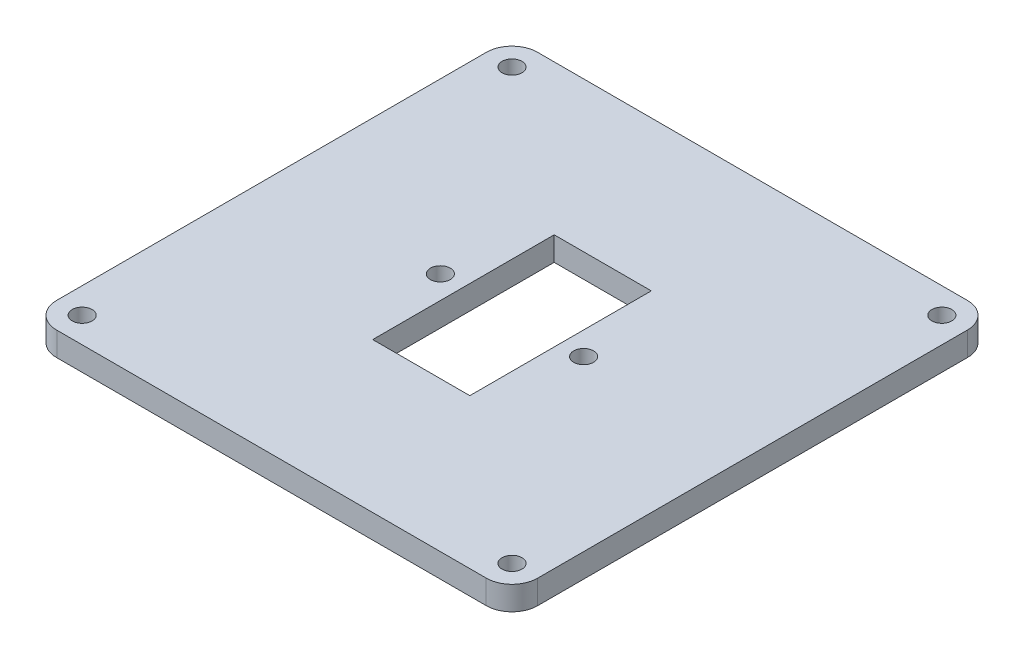
ISO-10303-21;
HEADER;
FILE_DESCRIPTION(('STEP AP214'),'2;1');
FILE_NAME('part.step','',(''),(''),'','','');
FILE_SCHEMA(('AUTOMOTIVE_DESIGN { 1 0 10303 214 1 1 1 1 }'));
ENDSEC;
DATA;
#1=APPLICATION_CONTEXT('core data for automotive mechanical design processes');
#2=APPLICATION_PROTOCOL_DEFINITION('international standard','automotive_design',2000,#1);
#3=PRODUCT_CONTEXT('',#1,'mechanical');
#4=PRODUCT('Part','Part','',(#3));
#5=PRODUCT_RELATED_PRODUCT_CATEGORY('part','',(#4));
#6=PRODUCT_DEFINITION_FORMATION('','',#4);
#7=PRODUCT_DEFINITION_CONTEXT('part definition',#1,'design');
#8=PRODUCT_DEFINITION('design','',#6,#7);
#9=PRODUCT_DEFINITION_SHAPE('','',#8);
#10=(LENGTH_UNIT() NAMED_UNIT(*) SI_UNIT(.MILLI.,.METRE.));
#11=(NAMED_UNIT(*) PLANE_ANGLE_UNIT() SI_UNIT($,.RADIAN.));
#12=(NAMED_UNIT(*) SI_UNIT($,.STERADIAN.) SOLID_ANGLE_UNIT());
#13=UNCERTAINTY_MEASURE_WITH_UNIT(LENGTH_MEASURE(1.E-05),#10,'distance_accuracy_value','');
#14=(GEOMETRIC_REPRESENTATION_CONTEXT(3) GLOBAL_UNCERTAINTY_ASSIGNED_CONTEXT((#13)) GLOBAL_UNIT_ASSIGNED_CONTEXT((#10,
#11,#12)) REPRESENTATION_CONTEXT('',''));
#15=CARTESIAN_POINT('',(0.,0.,0.));
#16=DIRECTION('',(0.,0.,1.));
#17=DIRECTION('',(1.,0.,0.));
#18=AXIS2_PLACEMENT_3D('',#15,#16,#17);
#19=CARTESIAN_POINT('',(-0.00955205768847229,3.,-148.405473966875));
#20=DIRECTION('',(-6.43645912334624E-05,0.,-0.9999999979286));
#21=DIRECTION('',(-0.9999999979286,0.,6.43645912334624E-05));
#22=AXIS2_PLACEMENT_3D('',#19,#20,#21);
#23=PLANE('',#22);
#24=DIRECTION('',(0.9999999979286,0.,-6.43645912334624E-05));
#25=VECTOR('',#24,1.);
#26=CARTESIAN_POINT('',(-0.00955205768847229,0.,-148.405473966875));
#27=LINE('',#26,#25);
#28=CARTESIAN_POINT('',(227.866056026075,0.,-148.420141087272));
#29=VERTEX_POINT('',#28);
#30=CARTESIAN_POINT('',(281.995647816193,0.,-148.423625116328));
#31=VERTEX_POINT('',#30);
#32=EDGE_CURVE('E222',#29,#31,#27,.T.);
#33=ORIENTED_EDGE('',*,*,#32,.F.);
#34=DIRECTION('',(0.,-1.,0.));
#35=VECTOR('',#34,1.);
#36=CARTESIAN_POINT('',(227.866056026075,3.,-148.420141087272));
#37=LINE('',#36,#35);
#38=CARTESIAN_POINT('',(227.866056026075,3.,-148.420141087272));
#39=VERTEX_POINT('',#38);
#40=EDGE_CURVE('E11',#39,#29,#37,.T.);
#41=ORIENTED_EDGE('',*,*,#40,.F.);
#42=DIRECTION('',(0.9999999979286,0.,-6.43645912334624E-05));
#43=VECTOR('',#42,1.);
#44=CARTESIAN_POINT('',(-0.00955205768847229,3.,-148.405473966875));
#45=LINE('',#44,#43);
#46=CARTESIAN_POINT('',(281.995647816193,3.,-148.423625116328));
#47=VERTEX_POINT('',#46);
#48=EDGE_CURVE('E279',#39,#47,#45,.T.);
#49=ORIENTED_EDGE('',*,*,#48,.T.);
#50=DIRECTION('',(0.,-1.,0.));
#51=VECTOR('',#50,1.);
#52=CARTESIAN_POINT('',(281.995647816193,3.,-148.423625116328));
#53=LINE('',#52,#51);
#54=EDGE_CURVE('E107',#47,#31,#53,.T.);
#55=ORIENTED_EDGE('',*,*,#54,.T.);
#56=EDGE_LOOP('',(#33,#41,#49,#55));
#57=FACE_BOUND('',#56,.T.);
#58=ADVANCED_FACE('F41',(#57),#23,.T.);
#59=CARTESIAN_POINT('',(228.017317101129,3.,-145.205782678348));
#60=DIRECTION('',(0.,-1.,0.));
#61=DIRECTION('',(0.,0.,-1.));
#62=AXIS2_PLACEMENT_3D('',#59,#60,#61);
#63=CYLINDRICAL_SURFACE('',#62,3.21791544772226);
#64=CARTESIAN_POINT('',(228.017317101129,0.,-145.205782678348));
#65=DIRECTION('',(0.,1.,0.));
#66=DIRECTION('',(0.,0.,1.));
#67=AXIS2_PLACEMENT_3D('',#64,#65,#66);
#68=CIRCLE('',#67,3.21791544772226);
#69=CARTESIAN_POINT('',(224.79940166353,0.,-145.205782678348));
#70=VERTEX_POINT('',#69);
#71=EDGE_CURVE('E218',#29,#70,#68,.T.);
#72=ORIENTED_EDGE('',*,*,#71,.T.);
#73=DIRECTION('',(0.,-1.,0.));
#74=VECTOR('',#73,1.);
#75=CARTESIAN_POINT('',(224.79940166353,3.,-145.205782678348));
#76=LINE('',#75,#74);
#77=CARTESIAN_POINT('',(224.79940166353,3.,-145.205782678348));
#78=VERTEX_POINT('',#77);
#79=EDGE_CURVE('E52',#78,#70,#76,.T.);
#80=ORIENTED_EDGE('',*,*,#79,.F.);
#81=CARTESIAN_POINT('',(228.017317101129,3.,-145.205782678348));
#82=DIRECTION('',(0.,1.,0.));
#83=DIRECTION('',(0.,0.,1.));
#84=AXIS2_PLACEMENT_3D('',#81,#82,#83);
#85=CIRCLE('',#84,3.21791544772226);
#86=EDGE_CURVE('E276',#39,#78,#85,.T.);
#87=ORIENTED_EDGE('',*,*,#86,.F.);
#88=ORIENTED_EDGE('',*,*,#40,.T.);
#89=EDGE_LOOP('',(#72,#80,#87,#88));
#90=FACE_BOUND('',#89,.T.);
#91=ADVANCED_FACE('F342',(#90),#63,.T.);
#92=CARTESIAN_POINT('',(224.799401663531,3.,-6.93270754580031E-13));
#93=DIRECTION('',(-1.,0.,0.));
#94=DIRECTION('',(0.,0.,1.));
#95=AXIS2_PLACEMENT_3D('',#92,#93,#94);
#96=PLANE('',#95);
#97=DIRECTION('',(0.,0.,-1.));
#98=VECTOR('',#97,1.);
#99=CARTESIAN_POINT('',(224.799401663531,0.,-6.93270754580031E-13));
#100=LINE('',#99,#98);
#101=CARTESIAN_POINT('',(224.799401663531,0.,-91.2057826783484));
#102=VERTEX_POINT('',#101);
#103=EDGE_CURVE('E214',#102,#70,#100,.T.);
#104=ORIENTED_EDGE('',*,*,#103,.F.);
#105=DIRECTION('',(0.,-1.,0.));
#106=VECTOR('',#105,1.);
#107=CARTESIAN_POINT('',(224.799401663531,3.,-91.2057826783484));
#108=LINE('',#107,#106);
#109=CARTESIAN_POINT('',(224.799401663531,3.,-91.2057826783484));
#110=VERTEX_POINT('',#109);
#111=EDGE_CURVE('E177',#110,#102,#108,.T.);
#112=ORIENTED_EDGE('',*,*,#111,.F.);
#113=DIRECTION('',(0.,0.,-1.));
#114=VECTOR('',#113,1.);
#115=CARTESIAN_POINT('',(224.799401663531,3.,-6.93270754580031E-13));
#116=LINE('',#115,#114);
#117=EDGE_CURVE('E272',#110,#78,#116,.T.);
#118=ORIENTED_EDGE('',*,*,#117,.T.);
#119=ORIENTED_EDGE('',*,*,#79,.T.);
#120=EDGE_LOOP('',(#104,#112,#118,#119));
#121=FACE_BOUND('',#120,.T.);
#122=ADVANCED_FACE('F347',(#121),#96,.T.);
#123=CARTESIAN_POINT('',(228.017317101129,3.,-91.2057826783484));
#124=DIRECTION('',(0.,-1.,0.));
#125=DIRECTION('',(0.,0.,-1.));
#126=AXIS2_PLACEMENT_3D('',#123,#124,#125);
#127=CYLINDRICAL_SURFACE('',#126,3.21791544772214);
#128=CARTESIAN_POINT('',(228.017317101129,0.,-91.2057826783484));
#129=DIRECTION('',(0.,1.,0.));
#130=DIRECTION('',(0.,0.,1.));
#131=AXIS2_PLACEMENT_3D('',#128,#129,#130);
#132=CIRCLE('',#131,3.21791544772214);
#133=CARTESIAN_POINT('',(228.042648658479,0.,-87.9879669275563));
#134=VERTEX_POINT('',#133);
#135=EDGE_CURVE('E210',#102,#134,#132,.T.);
#136=ORIENTED_EDGE('',*,*,#135,.T.);
#137=DIRECTION('',(0.,-1.,0.));
#138=VECTOR('',#137,1.);
#139=CARTESIAN_POINT('',(228.042648658479,3.,-87.9879669275563));
#140=LINE('',#139,#138);
#141=CARTESIAN_POINT('',(228.042648658479,3.,-87.9879669275563));
#142=VERTEX_POINT('',#141);
#143=EDGE_CURVE('E169',#142,#134,#140,.T.);
#144=ORIENTED_EDGE('',*,*,#143,.F.);
#145=CARTESIAN_POINT('',(228.017317101129,3.,-91.2057826783484));
#146=DIRECTION('',(0.,1.,0.));
#147=DIRECTION('',(0.,0.,1.));
#148=AXIS2_PLACEMENT_3D('',#145,#146,#147);
#149=CIRCLE('',#148,3.21791544772214);
#150=EDGE_CURVE('E269',#110,#142,#149,.T.);
#151=ORIENTED_EDGE('',*,*,#150,.F.);
#152=ORIENTED_EDGE('',*,*,#111,.T.);
#153=EDGE_LOOP('',(#136,#144,#151,#152));
#154=FACE_BOUND('',#153,.T.);
#155=ADVANCED_FACE('F390',(#154),#127,.T.);
#156=CARTESIAN_POINT('',(-1.13168967575386E-13,3.,-87.987966927556));
#157=DIRECTION('',(0.,0.,-1.));
#158=DIRECTION('',(-1.,0.,0.));
#159=AXIS2_PLACEMENT_3D('',#156,#157,#158);
#160=PLANE('',#159);
#161=DIRECTION('',(1.,0.,0.));
#162=VECTOR('',#161,1.);
#163=CARTESIAN_POINT('',(-1.13168967575386E-13,0.,-87.987966927556));
#164=LINE('',#163,#162);
#165=CARTESIAN_POINT('',(281.991993643367,0.,-87.9879669275564));
#166=VERTEX_POINT('',#165);
#167=EDGE_CURVE('E206',#134,#166,#164,.T.);
#168=ORIENTED_EDGE('',*,*,#167,.T.);
#169=DIRECTION('',(0.,-1.,0.));
#170=VECTOR('',#169,1.);
#171=CARTESIAN_POINT('',(281.991993643367,3.,-87.9879669275564));
#172=LINE('',#171,#170);
#173=CARTESIAN_POINT('',(281.991993643367,3.,-87.9879669275564));
#174=VERTEX_POINT('',#173);
#175=EDGE_CURVE('E165',#174,#166,#172,.T.);
#176=ORIENTED_EDGE('',*,*,#175,.F.);
#177=DIRECTION('',(1.,0.,0.));
#178=VECTOR('',#177,1.);
#179=CARTESIAN_POINT('',(-1.13168967575386E-13,3.,-87.987966927556));
#180=LINE('',#179,#178);
#181=EDGE_CURVE('E156',#142,#174,#180,.T.);
#182=ORIENTED_EDGE('',*,*,#181,.F.);
#183=ORIENTED_EDGE('',*,*,#143,.T.);
#184=EDGE_LOOP('',(#168,#176,#182,#183));
#185=FACE_BOUND('',#184,.T.);
#186=ADVANCED_FACE('F387',(#185),#160,.F.);
#187=CARTESIAN_POINT('',(282.017317101129,3.,-91.2057826783484));
#188=DIRECTION('',(0.,-1.,0.));
#189=DIRECTION('',(0.,0.,-1.));
#190=AXIS2_PLACEMENT_3D('',#187,#188,#189);
#191=CYLINDRICAL_SURFACE('',#190,3.21791538510439);
#192=CARTESIAN_POINT('',(282.017317101129,0.,-91.2057826783484));
#193=DIRECTION('',(0.,1.,0.));
#194=DIRECTION('',(0.,0.,1.));
#195=AXIS2_PLACEMENT_3D('',#192,#193,#194);
#196=CIRCLE('',#195,3.21791538510439);
#197=CARTESIAN_POINT('',(285.235232477242,0.,-91.2057826783484));
#198=VERTEX_POINT('',#197);
#199=EDGE_CURVE('E163',#166,#198,#196,.T.);
#200=ORIENTED_EDGE('',*,*,#199,.T.);
#201=DIRECTION('',(0.,-1.,0.));
#202=VECTOR('',#201,1.);
#203=CARTESIAN_POINT('',(285.235232477242,3.,-91.2057826783484));
#204=LINE('',#203,#202);
#205=CARTESIAN_POINT('',(285.235232477242,3.,-91.2057826783484));
#206=VERTEX_POINT('',#205);
#207=EDGE_CURVE('E147',#206,#198,#204,.T.);
#208=ORIENTED_EDGE('',*,*,#207,.F.);
#209=CARTESIAN_POINT('',(282.017317101129,3.,-91.2057826783484));
#210=DIRECTION('',(0.,1.,0.));
#211=DIRECTION('',(0.,0.,1.));
#212=AXIS2_PLACEMENT_3D('',#209,#210,#211);
#213=CIRCLE('',#212,3.21791538510439);
#214=EDGE_CURVE('E151',#174,#206,#213,.T.);
#215=ORIENTED_EDGE('',*,*,#214,.F.);
#216=ORIENTED_EDGE('',*,*,#175,.T.);
#217=EDGE_LOOP('',(#200,#208,#215,#216));
#218=FACE_BOUND('',#217,.T.);
#219=ADVANCED_FACE('F162',(#218),#191,.T.);
#220=CARTESIAN_POINT('',(285.235232477242,3.,2.93215262691319E-13));
#221=DIRECTION('',(-1.,0.,0.));
#222=DIRECTION('',(0.,0.,1.));
#223=AXIS2_PLACEMENT_3D('',#220,#221,#222);
#224=PLANE('',#223);
#225=DIRECTION('',(0.,0.,-1.));
#226=VECTOR('',#225,1.);
#227=CARTESIAN_POINT('',(285.235232477242,0.,2.93215262691319E-13));
#228=LINE('',#227,#226);
#229=CARTESIAN_POINT('',(285.235232477242,0.,-145.20616444973));
#230=VERTEX_POINT('',#229);
#231=EDGE_CURVE('E201',#198,#230,#228,.T.);
#232=ORIENTED_EDGE('',*,*,#231,.T.);
#233=DIRECTION('',(0.,-1.,0.));
#234=VECTOR('',#233,1.);
#235=CARTESIAN_POINT('',(285.235232477242,3.,-145.20616444973));
#236=LINE('',#235,#234);
#237=CARTESIAN_POINT('',(285.235232477242,3.,-145.20616444973));
#238=VERTEX_POINT('',#237);
#239=EDGE_CURVE('E149',#238,#230,#236,.T.);
#240=ORIENTED_EDGE('',*,*,#239,.F.);
#241=DIRECTION('',(0.,0.,-1.));
#242=VECTOR('',#241,1.);
#243=CARTESIAN_POINT('',(285.235232477242,3.,2.93215262691319E-13));
#244=LINE('',#243,#242);
#245=EDGE_CURVE('E142',#206,#238,#244,.T.);
#246=ORIENTED_EDGE('',*,*,#245,.F.);
#247=ORIENTED_EDGE('',*,*,#207,.T.);
#248=EDGE_LOOP('',(#232,#240,#246,#247));
#249=FACE_BOUND('',#248,.T.);
#250=ADVANCED_FACE('F145',(#249),#224,.F.);
#251=CARTESIAN_POINT('',(0.,3.,-129.606143662148));
#252=DIRECTION('',(0.,0.,1.));
#253=DIRECTION('',(1.,0.,0.));
#254=AXIS2_PLACEMENT_3D('',#251,#252,#253);
#255=PLANE('',#254);
#256=DIRECTION('',(-1.,0.,0.));
#257=VECTOR('',#256,1.);
#258=CARTESIAN_POINT('',(0.,0.,-129.606143662148));
#259=LINE('',#258,#257);
#260=CARTESIAN_POINT('',(261.117321150929,0.,-129.606143662148));
#261=VERTEX_POINT('',#260);
#262=CARTESIAN_POINT('',(248.917321150929,0.,-129.606143662148));
#263=VERTEX_POINT('',#262);
#264=EDGE_CURVE('E261',#261,#263,#259,.T.);
#265=ORIENTED_EDGE('',*,*,#264,.F.);
#266=DIRECTION('',(0.,-1.,0.));
#267=VECTOR('',#266,1.);
#268=CARTESIAN_POINT('',(261.117321150929,3.,-129.606143662148));
#269=LINE('',#268,#267);
#270=CARTESIAN_POINT('',(261.117321150929,3.,-129.606143662148));
#271=VERTEX_POINT('',#270);
#272=EDGE_CURVE('E45',#271,#261,#269,.T.);
#273=ORIENTED_EDGE('',*,*,#272,.F.);
#274=DIRECTION('',(-1.,0.,0.));
#275=VECTOR('',#274,1.);
#276=CARTESIAN_POINT('',(0.,3.,-129.606143662148));
#277=LINE('',#276,#275);
#278=CARTESIAN_POINT('',(248.917321150929,3.,-129.606143662148));
#279=VERTEX_POINT('',#278);
#280=EDGE_CURVE('E200',#271,#279,#277,.T.);
#281=ORIENTED_EDGE('',*,*,#280,.T.);
#282=DIRECTION('',(0.,-1.,0.));
#283=VECTOR('',#282,1.);
#284=CARTESIAN_POINT('',(248.917321150929,3.,-129.606143662148));
#285=LINE('',#284,#283);
#286=EDGE_CURVE('E182',#279,#263,#285,.T.);
#287=ORIENTED_EDGE('',*,*,#286,.T.);
#288=EDGE_LOOP('',(#265,#273,#281,#287));
#289=FACE_BOUND('',#288,.T.);
#290=ADVANCED_FACE('F43',(#289),#255,.T.);
#291=CARTESIAN_POINT('',(261.117321150929,3.,0.));
#292=DIRECTION('',(-1.,0.,0.));
#293=DIRECTION('',(0.,0.,1.));
#294=AXIS2_PLACEMENT_3D('',#291,#292,#293);
#295=PLANE('',#294);
#296=DIRECTION('',(0.,0.,-1.));
#297=VECTOR('',#296,1.);
#298=CARTESIAN_POINT('',(261.117321150929,0.,0.));
#299=LINE('',#298,#297);
#300=CARTESIAN_POINT('',(261.117321150929,0.,-106.806143662148));
#301=VERTEX_POINT('',#300);
#302=EDGE_CURVE('E257',#301,#261,#299,.T.);
#303=ORIENTED_EDGE('',*,*,#302,.F.);
#304=DIRECTION('',(0.,-1.,0.));
#305=VECTOR('',#304,1.);
#306=CARTESIAN_POINT('',(261.117321150929,3.,-106.806143662148));
#307=LINE('',#306,#305);
#308=CARTESIAN_POINT('',(261.117321150929,3.,-106.806143662148));
#309=VERTEX_POINT('',#308);
#310=EDGE_CURVE('E187',#309,#301,#307,.T.);
#311=ORIENTED_EDGE('',*,*,#310,.F.);
#312=DIRECTION('',(0.,0.,-1.));
#313=VECTOR('',#312,1.);
#314=CARTESIAN_POINT('',(261.117321150929,3.,0.));
#315=LINE('',#314,#313);
#316=EDGE_CURVE('E313',#309,#271,#315,.T.);
#317=ORIENTED_EDGE('',*,*,#316,.T.);
#318=ORIENTED_EDGE('',*,*,#272,.T.);
#319=EDGE_LOOP('',(#303,#311,#317,#318));
#320=FACE_BOUND('',#319,.T.);
#321=ADVANCED_FACE('F328',(#320),#295,.T.);
#322=CARTESIAN_POINT('',(0.,3.,-106.806143662148));
#323=DIRECTION('',(0.,0.,-1.));
#324=DIRECTION('',(-1.,0.,0.));
#325=AXIS2_PLACEMENT_3D('',#322,#323,#324);
#326=PLANE('',#325);
#327=DIRECTION('',(1.,0.,0.));
#328=VECTOR('',#327,1.);
#329=CARTESIAN_POINT('',(0.,0.,-106.806143662148));
#330=LINE('',#329,#328);
#331=CARTESIAN_POINT('',(248.917321150929,0.,-106.806143662148));
#332=VERTEX_POINT('',#331);
#333=EDGE_CURVE('E253',#332,#301,#330,.T.);
#334=ORIENTED_EDGE('',*,*,#333,.F.);
#335=DIRECTION('',(0.,-1.,0.));
#336=VECTOR('',#335,1.);
#337=CARTESIAN_POINT('',(248.917321150929,3.,-106.806143662148));
#338=LINE('',#337,#336);
#339=CARTESIAN_POINT('',(248.917321150929,3.,-106.806143662148));
#340=VERTEX_POINT('',#339);
#341=EDGE_CURVE('E185',#340,#332,#338,.T.);
#342=ORIENTED_EDGE('',*,*,#341,.F.);
#343=DIRECTION('',(1.,0.,0.));
#344=VECTOR('',#343,1.);
#345=CARTESIAN_POINT('',(0.,3.,-106.806143662148));
#346=LINE('',#345,#344);
#347=EDGE_CURVE('E310',#340,#309,#346,.T.);
#348=ORIENTED_EDGE('',*,*,#347,.T.);
#349=ORIENTED_EDGE('',*,*,#310,.T.);
#350=EDGE_LOOP('',(#334,#342,#348,#349));
#351=FACE_BOUND('',#350,.T.);
#352=ADVANCED_FACE('F329',(#351),#326,.T.);
#353=CARTESIAN_POINT('',(246.017321150929,3.,-118.206143662148));
#354=DIRECTION('',(0.,-1.,0.));
#355=DIRECTION('',(0.,0.,-1.));
#356=AXIS2_PLACEMENT_3D('',#353,#354,#355);
#357=CYLINDRICAL_SURFACE('',#356,1.25000000000001);
#358=CARTESIAN_POINT('',(246.017321150929,3.,-118.206143662148));
#359=DIRECTION('',(0.,1.,0.));
#360=DIRECTION('',(0.,0.,1.));
#361=AXIS2_PLACEMENT_3D('',#358,#359,#360);
#362=CIRCLE('',#361,1.25000000000001);
#363=CARTESIAN_POINT('',(246.017321150929,3.,-116.956143662148));
#364=VERTEX_POINT('',#363);
#365=EDGE_CURVE('E282',#364,#364,#362,.T.);
#366=ORIENTED_EDGE('',*,*,#365,.T.);
#367=EDGE_LOOP('',(#366));
#368=FACE_BOUND('',#367,.T.);
#369=CARTESIAN_POINT('',(246.017321150929,0.,-118.206143662148));
#370=DIRECTION('',(0.,1.,0.));
#371=DIRECTION('',(0.,0.,1.));
#372=AXIS2_PLACEMENT_3D('',#369,#370,#371);
#373=CIRCLE('',#372,1.25000000000001);
#374=CARTESIAN_POINT('',(246.017321150929,0.,-116.956143662148));
#375=VERTEX_POINT('',#374);
#376=EDGE_CURVE('E225',#375,#375,#373,.T.);
#377=ORIENTED_EDGE('',*,*,#376,.F.);
#378=EDGE_LOOP('',(#377));
#379=FACE_BOUND('',#378,.T.);
#380=ADVANCED_FACE('F331',(#368,#379),#357,.F.);
#381=CARTESIAN_POINT('',(264.017321150929,3.,-118.206143662148));
#382=DIRECTION('',(0.,-1.,0.));
#383=DIRECTION('',(0.,0.,-1.));
#384=AXIS2_PLACEMENT_3D('',#381,#382,#383);
#385=CYLINDRICAL_SURFACE('',#384,1.24999999999995);
#386=CARTESIAN_POINT('',(264.017321150929,3.,-118.206143662148));
#387=DIRECTION('',(0.,1.,0.));
#388=DIRECTION('',(0.,0.,1.));
#389=AXIS2_PLACEMENT_3D('',#386,#387,#388);
#390=CIRCLE('',#389,1.24999999999995);
#391=CARTESIAN_POINT('',(264.017321150929,3.,-116.956143662148));
#392=VERTEX_POINT('',#391);
#393=EDGE_CURVE('E286',#392,#392,#390,.T.);
#394=ORIENTED_EDGE('',*,*,#393,.T.);
#395=EDGE_LOOP('',(#394));
#396=FACE_BOUND('',#395,.T.);
#397=CARTESIAN_POINT('',(264.017321150929,0.,-118.206143662148));
#398=DIRECTION('',(0.,1.,0.));
#399=DIRECTION('',(0.,0.,1.));
#400=AXIS2_PLACEMENT_3D('',#397,#398,#399);
#401=CIRCLE('',#400,1.24999999999995);
#402=CARTESIAN_POINT('',(264.017321150929,0.,-116.956143662148));
#403=VERTEX_POINT('',#402);
#404=EDGE_CURVE('E229',#403,#403,#401,.T.);
#405=ORIENTED_EDGE('',*,*,#404,.F.);
#406=EDGE_LOOP('',(#405));
#407=FACE_BOUND('',#406,.T.);
#408=ADVANCED_FACE('F337',(#396,#407),#385,.F.);
#409=CARTESIAN_POINT('',(228.017317101129,3.,-145.205782678348));
#410=DIRECTION('',(0.,-1.,0.));
#411=DIRECTION('',(0.,0.,-1.));
#412=AXIS2_PLACEMENT_3D('',#409,#410,#411);
#413=CYLINDRICAL_SURFACE('',#412,1.25000000000001);
#414=CARTESIAN_POINT('',(228.017317101129,3.,-145.205782678348));
#415=DIRECTION('',(0.,1.,0.));
#416=DIRECTION('',(0.,0.,1.));
#417=AXIS2_PLACEMENT_3D('',#414,#415,#416);
#418=CIRCLE('',#417,1.25000000000001);
#419=CARTESIAN_POINT('',(228.017317101129,3.,-143.955782678348));
#420=VERTEX_POINT('',#419);
#421=EDGE_CURVE('E290',#420,#420,#418,.T.);
#422=ORIENTED_EDGE('',*,*,#421,.T.);
#423=EDGE_LOOP('',(#422));
#424=FACE_BOUND('',#423,.T.);
#425=CARTESIAN_POINT('',(228.017317101129,0.,-145.205782678348));
#426=DIRECTION('',(0.,1.,0.));
#427=DIRECTION('',(0.,0.,1.));
#428=AXIS2_PLACEMENT_3D('',#425,#426,#427);
#429=CIRCLE('',#428,1.25000000000001);
#430=CARTESIAN_POINT('',(228.017317101129,0.,-143.955782678348));
#431=VERTEX_POINT('',#430);
#432=EDGE_CURVE('E233',#431,#431,#429,.T.);
#433=ORIENTED_EDGE('',*,*,#432,.F.);
#434=EDGE_LOOP('',(#433));
#435=FACE_BOUND('',#434,.T.);
#436=ADVANCED_FACE('F354',(#424,#435),#413,.F.);
#437=CARTESIAN_POINT('',(282.017317101129,3.,-145.205782678348));
#438=DIRECTION('',(0.,-1.,0.));
#439=DIRECTION('',(0.,0.,-1.));
#440=AXIS2_PLACEMENT_3D('',#437,#438,#439);
#441=CYLINDRICAL_SURFACE('',#440,1.24999999999996);
#442=CARTESIAN_POINT('',(282.017317101129,3.,-145.205782678348));
#443=DIRECTION('',(0.,1.,0.));
#444=DIRECTION('',(0.,0.,1.));
#445=AXIS2_PLACEMENT_3D('',#442,#443,#444);
#446=CIRCLE('',#445,1.24999999999996);
#447=CARTESIAN_POINT('',(282.017317101129,3.,-143.955782678348));
#448=VERTEX_POINT('',#447);
#449=EDGE_CURVE('E294',#448,#448,#446,.T.);
#450=ORIENTED_EDGE('',*,*,#449,.T.);
#451=EDGE_LOOP('',(#450));
#452=FACE_BOUND('',#451,.T.);
#453=CARTESIAN_POINT('',(282.017317101129,0.,-145.205782678348));
#454=DIRECTION('',(0.,1.,0.));
#455=DIRECTION('',(0.,0.,1.));
#456=AXIS2_PLACEMENT_3D('',#453,#454,#455);
#457=CIRCLE('',#456,1.24999999999996);
#458=CARTESIAN_POINT('',(282.017317101129,0.,-143.955782678348));
#459=VERTEX_POINT('',#458);
#460=EDGE_CURVE('E237',#459,#459,#457,.T.);
#461=ORIENTED_EDGE('',*,*,#460,.F.);
#462=EDGE_LOOP('',(#461));
#463=FACE_BOUND('',#462,.T.);
#464=ADVANCED_FACE('F358',(#452,#463),#441,.F.);
#465=CARTESIAN_POINT('',(228.017317101129,3.,-91.2057826783484));
#466=DIRECTION('',(0.,-1.,0.));
#467=DIRECTION('',(0.,0.,-1.));
#468=AXIS2_PLACEMENT_3D('',#465,#466,#467);
#469=CYLINDRICAL_SURFACE('',#468,1.25000000000001);
#470=CARTESIAN_POINT('',(228.017317101129,3.,-91.2057826783484));
#471=DIRECTION('',(0.,1.,0.));
#472=DIRECTION('',(0.,0.,1.));
#473=AXIS2_PLACEMENT_3D('',#470,#471,#472);
#474=CIRCLE('',#473,1.25000000000001);
#475=CARTESIAN_POINT('',(228.017317101129,3.,-89.9557826783484));
#476=VERTEX_POINT('',#475);
#477=EDGE_CURVE('E298',#476,#476,#474,.T.);
#478=ORIENTED_EDGE('',*,*,#477,.T.);
#479=EDGE_LOOP('',(#478));
#480=FACE_BOUND('',#479,.T.);
#481=CARTESIAN_POINT('',(228.017317101129,0.,-91.2057826783484));
#482=DIRECTION('',(0.,1.,0.));
#483=DIRECTION('',(0.,0.,1.));
#484=AXIS2_PLACEMENT_3D('',#481,#482,#483);
#485=CIRCLE('',#484,1.25000000000001);
#486=CARTESIAN_POINT('',(228.017317101129,0.,-89.9557826783484));
#487=VERTEX_POINT('',#486);
#488=EDGE_CURVE('E241',#487,#487,#485,.T.);
#489=ORIENTED_EDGE('',*,*,#488,.F.);
#490=EDGE_LOOP('',(#489));
#491=FACE_BOUND('',#490,.T.);
#492=ADVANCED_FACE('F362',(#480,#491),#469,.F.);
#493=CARTESIAN_POINT('',(282.017317101129,3.,-91.2057826783484));
#494=DIRECTION('',(0.,-1.,0.));
#495=DIRECTION('',(0.,0.,-1.));
#496=AXIS2_PLACEMENT_3D('',#493,#494,#495);
#497=CYLINDRICAL_SURFACE('',#496,1.24999999999995);
#498=CARTESIAN_POINT('',(282.017317101129,3.,-91.2057826783484));
#499=DIRECTION('',(0.,1.,0.));
#500=DIRECTION('',(0.,0.,1.));
#501=AXIS2_PLACEMENT_3D('',#498,#499,#500);
#502=CIRCLE('',#501,1.24999999999995);
#503=CARTESIAN_POINT('',(282.017317101129,3.,-89.9557826783485));
#504=VERTEX_POINT('',#503);
#505=EDGE_CURVE('E302',#504,#504,#502,.T.);
#506=ORIENTED_EDGE('',*,*,#505,.T.);
#507=EDGE_LOOP('',(#506));
#508=FACE_BOUND('',#507,.T.);
#509=CARTESIAN_POINT('',(282.017317101129,0.,-91.2057826783484));
#510=DIRECTION('',(0.,1.,0.));
#511=DIRECTION('',(0.,0.,1.));
#512=AXIS2_PLACEMENT_3D('',#509,#510,#511);
#513=CIRCLE('',#512,1.24999999999995);
#514=CARTESIAN_POINT('',(282.017317101129,0.,-89.9557826783485));
#515=VERTEX_POINT('',#514);
#516=EDGE_CURVE('E245',#515,#515,#513,.T.);
#517=ORIENTED_EDGE('',*,*,#516,.F.);
#518=EDGE_LOOP('',(#517));
#519=FACE_BOUND('',#518,.T.);
#520=ADVANCED_FACE('F366',(#508,#519),#497,.F.);
#521=CARTESIAN_POINT('',(248.917321150929,3.,0.));
#522=DIRECTION('',(1.,0.,0.));
#523=DIRECTION('',(0.,0.,-1.));
#524=AXIS2_PLACEMENT_3D('',#521,#522,#523);
#525=PLANE('',#524);
#526=DIRECTION('',(0.,0.,1.));
#527=VECTOR('',#526,1.);
#528=CARTESIAN_POINT('',(248.917321150929,0.,0.));
#529=LINE('',#528,#527);
#530=EDGE_CURVE('E249',#263,#332,#529,.T.);
#531=ORIENTED_EDGE('',*,*,#530,.F.);
#532=ORIENTED_EDGE('',*,*,#286,.F.);
#533=DIRECTION('',(0.,0.,1.));
#534=VECTOR('',#533,1.);
#535=CARTESIAN_POINT('',(248.917321150929,3.,0.));
#536=LINE('',#535,#534);
#537=EDGE_CURVE('E306',#279,#340,#536,.T.);
#538=ORIENTED_EDGE('',*,*,#537,.T.);
#539=ORIENTED_EDGE('',*,*,#341,.T.);
#540=EDGE_LOOP('',(#531,#532,#538,#539));
#541=FACE_BOUND('',#540,.T.);
#542=ADVANCED_FACE('F324',(#541),#525,.T.);
#543=CARTESIAN_POINT('',(282.017317101129,3.,-145.205782678348));
#544=DIRECTION('',(0.,-1.,0.));
#545=DIRECTION('',(0.,0.,-1.));
#546=AXIS2_PLACEMENT_3D('',#543,#544,#545);
#547=CYLINDRICAL_SURFACE('',#546,3.21791539875965);
#548=CARTESIAN_POINT('',(282.017317101129,0.,-145.205782678348));
#549=DIRECTION('',(0.,1.,0.));
#550=DIRECTION('',(0.,0.,1.));
#551=AXIS2_PLACEMENT_3D('',#548,#549,#550);
#552=CIRCLE('',#551,3.21791539875965);
#553=EDGE_CURVE('E100',#230,#31,#552,.T.);
#554=ORIENTED_EDGE('',*,*,#553,.T.);
#555=ORIENTED_EDGE('',*,*,#54,.F.);
#556=CARTESIAN_POINT('',(282.017317101129,3.,-145.205782678348));
#557=DIRECTION('',(0.,1.,0.));
#558=DIRECTION('',(0.,0.,1.));
#559=AXIS2_PLACEMENT_3D('',#556,#557,#558);
#560=CIRCLE('',#559,3.21791539875965);
#561=EDGE_CURVE('E61',#238,#47,#560,.T.);
#562=ORIENTED_EDGE('',*,*,#561,.F.);
#563=ORIENTED_EDGE('',*,*,#239,.T.);
#564=EDGE_LOOP('',(#554,#555,#562,#563));
#565=FACE_BOUND('',#564,.T.);
#566=ADVANCED_FACE('F371',(#565),#547,.T.);
#567=CARTESIAN_POINT('',(0.,3.,0.));
#568=DIRECTION('',(0.,1.,0.));
#569=DIRECTION('',(0.,0.,1.));
#570=AXIS2_PLACEMENT_3D('',#567,#568,#569);
#571=PLANE('',#570);
#572=ORIENTED_EDGE('',*,*,#280,.F.);
#573=ORIENTED_EDGE('',*,*,#316,.F.);
#574=ORIENTED_EDGE('',*,*,#347,.F.);
#575=ORIENTED_EDGE('',*,*,#537,.F.);
#576=EDGE_LOOP('',(#572,#573,#574,#575));
#577=FACE_BOUND('',#576,.T.);
#578=ORIENTED_EDGE('',*,*,#505,.F.);
#579=EDGE_LOOP('',(#578));
#580=FACE_BOUND('',#579,.T.);
#581=ORIENTED_EDGE('',*,*,#477,.F.);
#582=EDGE_LOOP('',(#581));
#583=FACE_BOUND('',#582,.T.);
#584=ORIENTED_EDGE('',*,*,#449,.F.);
#585=EDGE_LOOP('',(#584));
#586=FACE_BOUND('',#585,.T.);
#587=ORIENTED_EDGE('',*,*,#421,.F.);
#588=EDGE_LOOP('',(#587));
#589=FACE_BOUND('',#588,.T.);
#590=ORIENTED_EDGE('',*,*,#393,.F.);
#591=EDGE_LOOP('',(#590));
#592=FACE_BOUND('',#591,.T.);
#593=ORIENTED_EDGE('',*,*,#365,.F.);
#594=EDGE_LOOP('',(#593));
#595=FACE_BOUND('',#594,.T.);
#596=ORIENTED_EDGE('',*,*,#48,.F.);
#597=ORIENTED_EDGE('',*,*,#86,.T.);
#598=ORIENTED_EDGE('',*,*,#117,.F.);
#599=ORIENTED_EDGE('',*,*,#150,.T.);
#600=ORIENTED_EDGE('',*,*,#181,.T.);
#601=ORIENTED_EDGE('',*,*,#214,.T.);
#602=ORIENTED_EDGE('',*,*,#245,.T.);
#603=ORIENTED_EDGE('',*,*,#561,.T.);
#604=EDGE_LOOP('',(#596,#597,#598,#599,#600,#601,#602,#603));
#605=FACE_BOUND('',#604,.T.);
#606=ADVANCED_FACE('F154',(#577,#580,#583,#586,#589,#592,#595,#605),#571,.T.);
#607=CARTESIAN_POINT('',(0.,0.,0.));
#608=DIRECTION('',(0.,1.,0.));
#609=DIRECTION('',(0.,0.,1.));
#610=AXIS2_PLACEMENT_3D('',#607,#608,#609);
#611=PLANE('',#610);
#612=ORIENTED_EDGE('',*,*,#264,.T.);
#613=ORIENTED_EDGE('',*,*,#530,.T.);
#614=ORIENTED_EDGE('',*,*,#333,.T.);
#615=ORIENTED_EDGE('',*,*,#302,.T.);
#616=EDGE_LOOP('',(#612,#613,#614,#615));
#617=FACE_BOUND('',#616,.T.);
#618=ORIENTED_EDGE('',*,*,#516,.T.);
#619=EDGE_LOOP('',(#618));
#620=FACE_BOUND('',#619,.T.);
#621=ORIENTED_EDGE('',*,*,#488,.T.);
#622=EDGE_LOOP('',(#621));
#623=FACE_BOUND('',#622,.T.);
#624=ORIENTED_EDGE('',*,*,#460,.T.);
#625=EDGE_LOOP('',(#624));
#626=FACE_BOUND('',#625,.T.);
#627=ORIENTED_EDGE('',*,*,#432,.T.);
#628=EDGE_LOOP('',(#627));
#629=FACE_BOUND('',#628,.T.);
#630=ORIENTED_EDGE('',*,*,#404,.T.);
#631=EDGE_LOOP('',(#630));
#632=FACE_BOUND('',#631,.T.);
#633=ORIENTED_EDGE('',*,*,#376,.T.);
#634=EDGE_LOOP('',(#633));
#635=FACE_BOUND('',#634,.T.);
#636=ORIENTED_EDGE('',*,*,#32,.T.);
#637=ORIENTED_EDGE('',*,*,#553,.F.);
#638=ORIENTED_EDGE('',*,*,#231,.F.);
#639=ORIENTED_EDGE('',*,*,#199,.F.);
#640=ORIENTED_EDGE('',*,*,#167,.F.);
#641=ORIENTED_EDGE('',*,*,#135,.F.);
#642=ORIENTED_EDGE('',*,*,#103,.T.);
#643=ORIENTED_EDGE('',*,*,#71,.F.);
#644=EDGE_LOOP('',(#636,#637,#638,#639,#640,#641,#642,#643));
#645=FACE_BOUND('',#644,.T.);
#646=ADVANCED_FACE('F326',(#617,#620,#623,#626,#629,#632,#635,#645),#611,.F.);
#647=CLOSED_SHELL('',(#58,#91,#122,#155,#186,#219,#250,#290,#321,#352,#380,#408,#436,#464,#492,
#520,#542,#566,#606,#646));
#648=MANIFOLD_SOLID_BREP('B2',#647);
#649=ADVANCED_BREP_SHAPE_REPRESENTATION('',(#18,#648),#14);
#650=SHAPE_DEFINITION_REPRESENTATION(#9,#649);
ENDSEC;
END-ISO-10303-21;
